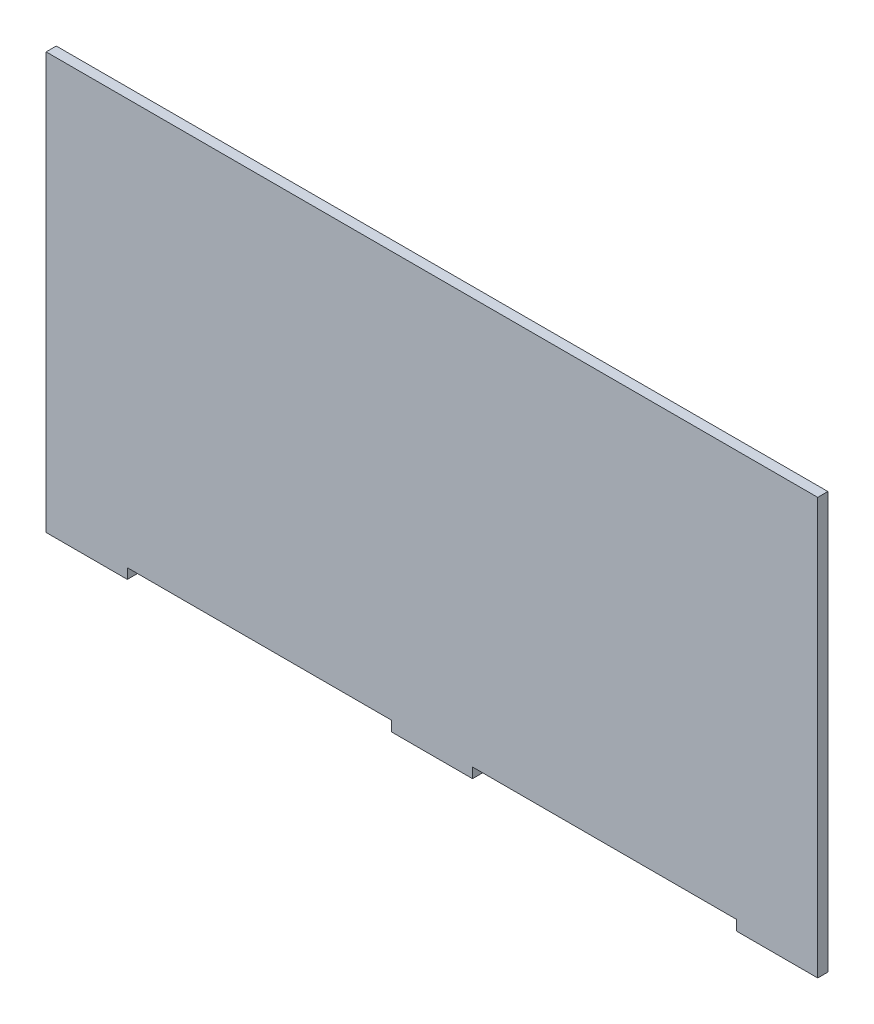
ISO-10303-21;
HEADER;
FILE_DESCRIPTION(('STEP AP214'),'2;1');
FILE_NAME('part.step','',(''),(''),'','','');
FILE_SCHEMA(('AUTOMOTIVE_DESIGN { 1 0 10303 214 1 1 1 1 }'));
ENDSEC;
DATA;
#1=APPLICATION_CONTEXT('core data for automotive mechanical design processes');
#2=APPLICATION_PROTOCOL_DEFINITION('international standard','automotive_design',2000,#1);
#3=PRODUCT_CONTEXT('',#1,'mechanical');
#4=PRODUCT('Part','Part','',(#3));
#5=PRODUCT_RELATED_PRODUCT_CATEGORY('part','',(#4));
#6=PRODUCT_DEFINITION_FORMATION('','',#4);
#7=PRODUCT_DEFINITION_CONTEXT('part definition',#1,'design');
#8=PRODUCT_DEFINITION('design','',#6,#7);
#9=PRODUCT_DEFINITION_SHAPE('','',#8);
#10=(LENGTH_UNIT() NAMED_UNIT(*) SI_UNIT(.MILLI.,.METRE.));
#11=(NAMED_UNIT(*) PLANE_ANGLE_UNIT() SI_UNIT($,.RADIAN.));
#12=(NAMED_UNIT(*) SI_UNIT($,.STERADIAN.) SOLID_ANGLE_UNIT());
#13=UNCERTAINTY_MEASURE_WITH_UNIT(LENGTH_MEASURE(1.E-05),#10,'distance_accuracy_value','');
#14=(GEOMETRIC_REPRESENTATION_CONTEXT(3) GLOBAL_UNCERTAINTY_ASSIGNED_CONTEXT((#13)) GLOBAL_UNIT_ASSIGNED_CONTEXT((#10,
#11,#12)) REPRESENTATION_CONTEXT('',''));
#15=CARTESIAN_POINT('',(0.,0.,0.));
#16=DIRECTION('',(0.,0.,1.));
#17=DIRECTION('',(1.,0.,0.));
#18=AXIS2_PLACEMENT_3D('',#15,#16,#17);
#19=CARTESIAN_POINT('',(-39.4746265952279,-50.5700031644856,5.));
#20=DIRECTION('',(1.,0.,0.));
#21=DIRECTION('',(0.,1.,0.));
#22=AXIS2_PLACEMENT_3D('',#19,#20,#21);
#23=PLANE('',#22);
#24=DIRECTION('',(0.,-1.,0.));
#25=VECTOR('',#24,1.);
#26=CARTESIAN_POINT('',(-39.4746265952279,-50.5700031644856,0.));
#27=LINE('',#26,#25);
#28=CARTESIAN_POINT('',(-39.4746265952279,154.429996835514,0.));
#29=VERTEX_POINT('',#28);
#30=CARTESIAN_POINT('',(-39.4746265952279,-50.5700031644856,0.));
#31=VERTEX_POINT('',#30);
#32=EDGE_CURVE('E159',#29,#31,#27,.T.);
#33=ORIENTED_EDGE('',*,*,#32,.T.);
#34=DIRECTION('',(0.,0.,-1.));
#35=VECTOR('',#34,1.);
#36=CARTESIAN_POINT('',(-39.4746265952279,-50.5700031644856,5.));
#37=LINE('',#36,#35);
#38=CARTESIAN_POINT('',(-39.4746265952279,-50.5700031644856,5.));
#39=VERTEX_POINT('',#38);
#40=EDGE_CURVE('E11',#39,#31,#37,.T.);
#41=ORIENTED_EDGE('',*,*,#40,.F.);
#42=DIRECTION('',(0.,-1.,0.));
#43=VECTOR('',#42,1.);
#44=CARTESIAN_POINT('',(-39.4746265952279,-50.5700031644856,5.));
#45=LINE('',#44,#43);
#46=CARTESIAN_POINT('',(-39.4746265952279,154.429996835514,5.));
#47=VERTEX_POINT('',#46);
#48=EDGE_CURVE('E181',#47,#39,#45,.T.);
#49=ORIENTED_EDGE('',*,*,#48,.F.);
#50=DIRECTION('',(0.,0.,-1.));
#51=VECTOR('',#50,1.);
#52=CARTESIAN_POINT('',(-39.4746265952279,154.429996835514,5.));
#53=LINE('',#52,#51);
#54=EDGE_CURVE('E155',#47,#29,#53,.T.);
#55=ORIENTED_EDGE('',*,*,#54,.T.);
#56=EDGE_LOOP('',(#33,#41,#49,#55));
#57=FACE_BOUND('',#56,.T.);
#58=ADVANCED_FACE('F39',(#57),#23,.F.);
#59=CARTESIAN_POINT('',(-39.4746265952279,-50.5700031644856,5.));
#60=DIRECTION('',(0.,1.,0.));
#61=DIRECTION('',(-1.,0.,0.));
#62=AXIS2_PLACEMENT_3D('',#59,#60,#61);
#63=PLANE('',#62);
#64=DIRECTION('',(1.,0.,0.));
#65=VECTOR('',#64,1.);
#66=CARTESIAN_POINT('',(-39.4746265952279,-50.5700031644856,0.));
#67=LINE('',#66,#65);
#68=CARTESIAN_POINT('',(0.525373404772073,-50.5700031644856,0.));
#69=VERTEX_POINT('',#68);
#70=EDGE_CURVE('E162',#31,#69,#67,.T.);
#71=ORIENTED_EDGE('',*,*,#70,.T.);
#72=DIRECTION('',(0.,0.,-1.));
#73=VECTOR('',#72,1.);
#74=CARTESIAN_POINT('',(0.525373404772073,-50.5700031644856,5.));
#75=LINE('',#74,#73);
#76=CARTESIAN_POINT('',(0.525373404772073,-50.5700031644856,5.));
#77=VERTEX_POINT('',#76);
#78=EDGE_CURVE('E47',#77,#69,#75,.T.);
#79=ORIENTED_EDGE('',*,*,#78,.F.);
#80=DIRECTION('',(1.,0.,0.));
#81=VECTOR('',#80,1.);
#82=CARTESIAN_POINT('',(-39.4746265952279,-50.5700031644856,5.));
#83=LINE('',#82,#81);
#84=EDGE_CURVE('E110',#39,#77,#83,.T.);
#85=ORIENTED_EDGE('',*,*,#84,.F.);
#86=ORIENTED_EDGE('',*,*,#40,.T.);
#87=EDGE_LOOP('',(#71,#79,#85,#86));
#88=FACE_BOUND('',#87,.T.);
#89=ADVANCED_FACE('F259',(#88),#63,.F.);
#90=CARTESIAN_POINT('',(0.525373404772073,-50.5700031644856,5.));
#91=DIRECTION('',(-1.,0.,0.));
#92=DIRECTION('',(0.,-1.,0.));
#93=AXIS2_PLACEMENT_3D('',#90,#91,#92);
#94=PLANE('',#93);
#95=DIRECTION('',(0.,1.,0.));
#96=VECTOR('',#95,1.);
#97=CARTESIAN_POINT('',(0.525373404772073,-50.5700031644856,0.));
#98=LINE('',#97,#96);
#99=CARTESIAN_POINT('',(0.525373404772073,-45.5700031644856,0.));
#100=VERTEX_POINT('',#99);
#101=EDGE_CURVE('E164',#69,#100,#98,.T.);
#102=ORIENTED_EDGE('',*,*,#101,.T.);
#103=DIRECTION('',(0.,0.,-1.));
#104=VECTOR('',#103,1.);
#105=CARTESIAN_POINT('',(0.525373404772073,-45.5700031644856,5.));
#106=LINE('',#105,#104);
#107=CARTESIAN_POINT('',(0.525373404772073,-45.5700031644856,5.));
#108=VERTEX_POINT('',#107);
#109=EDGE_CURVE('E200',#108,#100,#106,.T.);
#110=ORIENTED_EDGE('',*,*,#109,.F.);
#111=DIRECTION('',(0.,1.,0.));
#112=VECTOR('',#111,1.);
#113=CARTESIAN_POINT('',(0.525373404772073,-50.5700031644856,5.));
#114=LINE('',#113,#112);
#115=EDGE_CURVE('E208',#77,#108,#114,.T.);
#116=ORIENTED_EDGE('',*,*,#115,.F.);
#117=ORIENTED_EDGE('',*,*,#78,.T.);
#118=EDGE_LOOP('',(#102,#110,#116,#117));
#119=FACE_BOUND('',#118,.T.);
#120=ADVANCED_FACE('F206',(#119),#94,.F.);
#121=CARTESIAN_POINT('',(0.525373404772073,-45.5700031644856,5.));
#122=DIRECTION('',(0.,1.,0.));
#123=DIRECTION('',(-1.,0.,0.));
#124=AXIS2_PLACEMENT_3D('',#121,#122,#123);
#125=PLANE('',#124);
#126=DIRECTION('',(1.,0.,0.));
#127=VECTOR('',#126,1.);
#128=CARTESIAN_POINT('',(0.525373404772073,-45.5700031644856,0.));
#129=LINE('',#128,#127);
#130=CARTESIAN_POINT('',(130.525373404772,-45.5700031644856,0.));
#131=VERTEX_POINT('',#130);
#132=EDGE_CURVE('E166',#100,#131,#129,.T.);
#133=ORIENTED_EDGE('',*,*,#132,.T.);
#134=DIRECTION('',(0.,0.,-1.));
#135=VECTOR('',#134,1.);
#136=CARTESIAN_POINT('',(130.525373404772,-45.5700031644856,5.));
#137=LINE('',#136,#135);
#138=CARTESIAN_POINT('',(130.525373404772,-45.5700031644856,5.));
#139=VERTEX_POINT('',#138);
#140=EDGE_CURVE('E197',#139,#131,#137,.T.);
#141=ORIENTED_EDGE('',*,*,#140,.F.);
#142=DIRECTION('',(1.,0.,0.));
#143=VECTOR('',#142,1.);
#144=CARTESIAN_POINT('',(0.525373404772073,-45.5700031644856,5.));
#145=LINE('',#144,#143);
#146=EDGE_CURVE('E226',#108,#139,#145,.T.);
#147=ORIENTED_EDGE('',*,*,#146,.F.);
#148=ORIENTED_EDGE('',*,*,#109,.T.);
#149=EDGE_LOOP('',(#133,#141,#147,#148));
#150=FACE_BOUND('',#149,.T.);
#151=ADVANCED_FACE('F217',(#150),#125,.F.);
#152=CARTESIAN_POINT('',(130.525373404772,-45.5700031644856,5.));
#153=DIRECTION('',(1.,0.,0.));
#154=DIRECTION('',(0.,0.,-1.));
#155=AXIS2_PLACEMENT_3D('',#152,#153,#154);
#156=PLANE('',#155);
#157=DIRECTION('',(0.,-1.,0.));
#158=VECTOR('',#157,1.);
#159=CARTESIAN_POINT('',(130.525373404772,-45.5700031644856,0.));
#160=LINE('',#159,#158);
#161=CARTESIAN_POINT('',(130.525373404772,-50.5700031644856,0.));
#162=VERTEX_POINT('',#161);
#163=EDGE_CURVE('E168',#131,#162,#160,.T.);
#164=ORIENTED_EDGE('',*,*,#163,.T.);
#165=DIRECTION('',(0.,0.,-1.));
#166=VECTOR('',#165,1.);
#167=CARTESIAN_POINT('',(130.525373404772,-50.5700031644856,5.));
#168=LINE('',#167,#166);
#169=CARTESIAN_POINT('',(130.525373404772,-50.5700031644856,5.));
#170=VERTEX_POINT('',#169);
#171=EDGE_CURVE('E194',#170,#162,#168,.T.);
#172=ORIENTED_EDGE('',*,*,#171,.F.);
#173=DIRECTION('',(0.,-1.,0.));
#174=VECTOR('',#173,1.);
#175=CARTESIAN_POINT('',(130.525373404772,-45.5700031644856,5.));
#176=LINE('',#175,#174);
#177=EDGE_CURVE('E223',#139,#170,#176,.T.);
#178=ORIENTED_EDGE('',*,*,#177,.F.);
#179=ORIENTED_EDGE('',*,*,#140,.T.);
#180=EDGE_LOOP('',(#164,#172,#178,#179));
#181=FACE_BOUND('',#180,.T.);
#182=ADVANCED_FACE('F221',(#181),#156,.F.);
#183=CARTESIAN_POINT('',(130.525373404772,-50.5700031644856,5.));
#184=DIRECTION('',(0.,1.,0.));
#185=DIRECTION('',(0.,0.,1.));
#186=AXIS2_PLACEMENT_3D('',#183,#184,#185);
#187=PLANE('',#186);
#188=DIRECTION('',(1.,0.,0.));
#189=VECTOR('',#188,1.);
#190=CARTESIAN_POINT('',(130.525373404772,-50.5700031644856,0.));
#191=LINE('',#190,#189);
#192=CARTESIAN_POINT('',(170.525373404772,-50.5700031644856,0.));
#193=VERTEX_POINT('',#192);
#194=EDGE_CURVE('E170',#162,#193,#191,.T.);
#195=ORIENTED_EDGE('',*,*,#194,.T.);
#196=DIRECTION('',(0.,0.,-1.));
#197=VECTOR('',#196,1.);
#198=CARTESIAN_POINT('',(170.525373404772,-50.5700031644856,5.));
#199=LINE('',#198,#197);
#200=CARTESIAN_POINT('',(170.525373404772,-50.5700031644856,5.));
#201=VERTEX_POINT('',#200);
#202=EDGE_CURVE('E191',#201,#193,#199,.T.);
#203=ORIENTED_EDGE('',*,*,#202,.F.);
#204=DIRECTION('',(1.,0.,0.));
#205=VECTOR('',#204,1.);
#206=CARTESIAN_POINT('',(130.525373404772,-50.5700031644856,5.));
#207=LINE('',#206,#205);
#208=EDGE_CURVE('E225',#170,#201,#207,.T.);
#209=ORIENTED_EDGE('',*,*,#208,.F.);
#210=ORIENTED_EDGE('',*,*,#171,.T.);
#211=EDGE_LOOP('',(#195,#203,#209,#210));
#212=FACE_BOUND('',#211,.T.);
#213=ADVANCED_FACE('F272',(#212),#187,.F.);
#214=CARTESIAN_POINT('',(170.525373404772,-50.5700031644856,5.));
#215=DIRECTION('',(-1.,0.,0.));
#216=DIRECTION('',(0.,0.,1.));
#217=AXIS2_PLACEMENT_3D('',#214,#215,#216);
#218=PLANE('',#217);
#219=DIRECTION('',(0.,1.,0.));
#220=VECTOR('',#219,1.);
#221=CARTESIAN_POINT('',(170.525373404772,-50.5700031644856,0.));
#222=LINE('',#221,#220);
#223=CARTESIAN_POINT('',(170.525373404772,-45.5700031644856,0.));
#224=VERTEX_POINT('',#223);
#225=EDGE_CURVE('E172',#193,#224,#222,.T.);
#226=ORIENTED_EDGE('',*,*,#225,.T.);
#227=DIRECTION('',(0.,0.,-1.));
#228=VECTOR('',#227,1.);
#229=CARTESIAN_POINT('',(170.525373404772,-45.5700031644856,5.));
#230=LINE('',#229,#228);
#231=CARTESIAN_POINT('',(170.525373404772,-45.5700031644856,5.));
#232=VERTEX_POINT('',#231);
#233=EDGE_CURVE('E188',#232,#224,#230,.T.);
#234=ORIENTED_EDGE('',*,*,#233,.F.);
#235=DIRECTION('',(0.,1.,0.));
#236=VECTOR('',#235,1.);
#237=CARTESIAN_POINT('',(170.525373404772,-50.5700031644856,5.));
#238=LINE('',#237,#236);
#239=EDGE_CURVE('E228',#201,#232,#238,.T.);
#240=ORIENTED_EDGE('',*,*,#239,.F.);
#241=ORIENTED_EDGE('',*,*,#202,.T.);
#242=EDGE_LOOP('',(#226,#234,#240,#241));
#243=FACE_BOUND('',#242,.T.);
#244=ADVANCED_FACE('F275',(#243),#218,.F.);
#245=CARTESIAN_POINT('',(170.525373404772,-45.5700031644856,5.));
#246=DIRECTION('',(0.,1.,0.));
#247=DIRECTION('',(0.,0.,1.));
#248=AXIS2_PLACEMENT_3D('',#245,#246,#247);
#249=PLANE('',#248);
#250=DIRECTION('',(1.,0.,0.));
#251=VECTOR('',#250,1.);
#252=CARTESIAN_POINT('',(170.525373404772,-45.5700031644856,0.));
#253=LINE('',#252,#251);
#254=CARTESIAN_POINT('',(300.525373404772,-45.5700031644856,0.));
#255=VERTEX_POINT('',#254);
#256=EDGE_CURVE('E174',#224,#255,#253,.T.);
#257=ORIENTED_EDGE('',*,*,#256,.T.);
#258=DIRECTION('',(0.,0.,-1.));
#259=VECTOR('',#258,1.);
#260=CARTESIAN_POINT('',(300.525373404772,-45.5700031644856,5.));
#261=LINE('',#260,#259);
#262=CARTESIAN_POINT('',(300.525373404772,-45.5700031644856,5.));
#263=VERTEX_POINT('',#262);
#264=EDGE_CURVE('E185',#263,#255,#261,.T.);
#265=ORIENTED_EDGE('',*,*,#264,.F.);
#266=DIRECTION('',(1.,0.,0.));
#267=VECTOR('',#266,1.);
#268=CARTESIAN_POINT('',(170.525373404772,-45.5700031644856,5.));
#269=LINE('',#268,#267);
#270=EDGE_CURVE('E234',#232,#263,#269,.T.);
#271=ORIENTED_EDGE('',*,*,#270,.F.);
#272=ORIENTED_EDGE('',*,*,#233,.T.);
#273=EDGE_LOOP('',(#257,#265,#271,#272));
#274=FACE_BOUND('',#273,.T.);
#275=ADVANCED_FACE('F240',(#274),#249,.F.);
#276=CARTESIAN_POINT('',(300.525373404772,-45.5700031644856,5.));
#277=DIRECTION('',(1.,0.,0.));
#278=DIRECTION('',(0.,0.,-1.));
#279=AXIS2_PLACEMENT_3D('',#276,#277,#278);
#280=PLANE('',#279);
#281=DIRECTION('',(0.,-1.,0.));
#282=VECTOR('',#281,1.);
#283=CARTESIAN_POINT('',(300.525373404772,-45.5700031644856,0.));
#284=LINE('',#283,#282);
#285=CARTESIAN_POINT('',(300.525373404772,-50.5700031644856,0.));
#286=VERTEX_POINT('',#285);
#287=EDGE_CURVE('E176',#255,#286,#284,.T.);
#288=ORIENTED_EDGE('',*,*,#287,.T.);
#289=DIRECTION('',(0.,0.,-1.));
#290=VECTOR('',#289,1.);
#291=CARTESIAN_POINT('',(300.525373404772,-50.5700031644856,5.));
#292=LINE('',#291,#290);
#293=CARTESIAN_POINT('',(300.525373404772,-50.5700031644856,5.));
#294=VERTEX_POINT('',#293);
#295=EDGE_CURVE('E150',#294,#286,#292,.T.);
#296=ORIENTED_EDGE('',*,*,#295,.F.);
#297=DIRECTION('',(0.,-1.,0.));
#298=VECTOR('',#297,1.);
#299=CARTESIAN_POINT('',(300.525373404772,-45.5700031644856,5.));
#300=LINE('',#299,#298);
#301=EDGE_CURVE('E141',#263,#294,#300,.T.);
#302=ORIENTED_EDGE('',*,*,#301,.F.);
#303=ORIENTED_EDGE('',*,*,#264,.T.);
#304=EDGE_LOOP('',(#288,#296,#302,#303));
#305=FACE_BOUND('',#304,.T.);
#306=ADVANCED_FACE('F244',(#305),#280,.F.);
#307=CARTESIAN_POINT('',(300.525373404772,-50.5700031644856,5.));
#308=DIRECTION('',(0.,1.,0.));
#309=DIRECTION('',(0.,0.,1.));
#310=AXIS2_PLACEMENT_3D('',#307,#308,#309);
#311=PLANE('',#310);
#312=DIRECTION('',(1.,0.,0.));
#313=VECTOR('',#312,1.);
#314=CARTESIAN_POINT('',(300.525373404772,-50.5700031644856,0.));
#315=LINE('',#314,#313);
#316=CARTESIAN_POINT('',(340.525373404772,-50.5700031644856,0.));
#317=VERTEX_POINT('',#316);
#318=EDGE_CURVE('E149',#286,#317,#315,.T.);
#319=ORIENTED_EDGE('',*,*,#318,.T.);
#320=DIRECTION('',(0.,0.,-1.));
#321=VECTOR('',#320,1.);
#322=CARTESIAN_POINT('',(340.525373404772,-50.5700031644856,5.));
#323=LINE('',#322,#321);
#324=CARTESIAN_POINT('',(340.525373404772,-50.5700031644856,5.));
#325=VERTEX_POINT('',#324);
#326=EDGE_CURVE('E146',#325,#317,#323,.T.);
#327=ORIENTED_EDGE('',*,*,#326,.F.);
#328=DIRECTION('',(1.,0.,0.));
#329=VECTOR('',#328,1.);
#330=CARTESIAN_POINT('',(300.525373404772,-50.5700031644856,5.));
#331=LINE('',#330,#329);
#332=EDGE_CURVE('E135',#294,#325,#331,.T.);
#333=ORIENTED_EDGE('',*,*,#332,.F.);
#334=ORIENTED_EDGE('',*,*,#295,.T.);
#335=EDGE_LOOP('',(#319,#327,#333,#334));
#336=FACE_BOUND('',#335,.T.);
#337=ADVANCED_FACE('F147',(#336),#311,.F.);
#338=CARTESIAN_POINT('',(340.525373404772,-50.5700031644856,5.));
#339=DIRECTION('',(-1.,0.,0.));
#340=DIRECTION('',(0.,0.,1.));
#341=AXIS2_PLACEMENT_3D('',#338,#339,#340);
#342=PLANE('',#341);
#343=DIRECTION('',(0.,1.,0.));
#344=VECTOR('',#343,1.);
#345=CARTESIAN_POINT('',(340.525373404772,-50.5700031644856,0.));
#346=LINE('',#345,#344);
#347=CARTESIAN_POINT('',(340.525373404772,154.429996835514,0.));
#348=VERTEX_POINT('',#347);
#349=EDGE_CURVE('E96',#317,#348,#346,.T.);
#350=ORIENTED_EDGE('',*,*,#349,.T.);
#351=DIRECTION('',(0.,0.,-1.));
#352=VECTOR('',#351,1.);
#353=CARTESIAN_POINT('',(340.525373404772,154.429996835514,5.));
#354=LINE('',#353,#352);
#355=CARTESIAN_POINT('',(340.525373404772,154.429996835514,5.));
#356=VERTEX_POINT('',#355);
#357=EDGE_CURVE('E151',#356,#348,#354,.T.);
#358=ORIENTED_EDGE('',*,*,#357,.F.);
#359=DIRECTION('',(0.,1.,0.));
#360=VECTOR('',#359,1.);
#361=CARTESIAN_POINT('',(340.525373404772,-50.5700031644856,5.));
#362=LINE('',#361,#360);
#363=EDGE_CURVE('E139',#325,#356,#362,.T.);
#364=ORIENTED_EDGE('',*,*,#363,.F.);
#365=ORIENTED_EDGE('',*,*,#326,.T.);
#366=EDGE_LOOP('',(#350,#358,#364,#365));
#367=FACE_BOUND('',#366,.T.);
#368=ADVANCED_FACE('F153',(#367),#342,.F.);
#369=CARTESIAN_POINT('',(340.525373404772,154.429996835514,5.));
#370=DIRECTION('',(0.,-1.,0.));
#371=DIRECTION('',(1.,0.,0.));
#372=AXIS2_PLACEMENT_3D('',#369,#370,#371);
#373=PLANE('',#372);
#374=DIRECTION('',(-1.,0.,0.));
#375=VECTOR('',#374,1.);
#376=CARTESIAN_POINT('',(340.525373404772,154.429996835514,0.));
#377=LINE('',#376,#375);
#378=EDGE_CURVE('E102',#348,#29,#377,.T.);
#379=ORIENTED_EDGE('',*,*,#378,.T.);
#380=ORIENTED_EDGE('',*,*,#54,.F.);
#381=DIRECTION('',(-1.,0.,0.));
#382=VECTOR('',#381,1.);
#383=CARTESIAN_POINT('',(340.525373404772,154.429996835514,5.));
#384=LINE('',#383,#382);
#385=EDGE_CURVE('E55',#356,#47,#384,.T.);
#386=ORIENTED_EDGE('',*,*,#385,.F.);
#387=ORIENTED_EDGE('',*,*,#357,.T.);
#388=EDGE_LOOP('',(#379,#380,#386,#387));
#389=FACE_BOUND('',#388,.T.);
#390=ADVANCED_FACE('F248',(#389),#373,.F.);
#391=CARTESIAN_POINT('',(0.,0.,5.));
#392=DIRECTION('',(0.,0.,1.));
#393=DIRECTION('',(1.,0.,0.));
#394=AXIS2_PLACEMENT_3D('',#391,#392,#393);
#395=PLANE('',#394);
#396=ORIENTED_EDGE('',*,*,#48,.T.);
#397=ORIENTED_EDGE('',*,*,#84,.T.);
#398=ORIENTED_EDGE('',*,*,#115,.T.);
#399=ORIENTED_EDGE('',*,*,#146,.T.);
#400=ORIENTED_EDGE('',*,*,#177,.T.);
#401=ORIENTED_EDGE('',*,*,#208,.T.);
#402=ORIENTED_EDGE('',*,*,#239,.T.);
#403=ORIENTED_EDGE('',*,*,#270,.T.);
#404=ORIENTED_EDGE('',*,*,#301,.T.);
#405=ORIENTED_EDGE('',*,*,#332,.T.);
#406=ORIENTED_EDGE('',*,*,#363,.T.);
#407=ORIENTED_EDGE('',*,*,#385,.T.);
#408=EDGE_LOOP('',(#396,#397,#398,#399,#400,#401,#402,#403,#404,#405,#406,#407));
#409=FACE_BOUND('',#408,.T.);
#410=ADVANCED_FACE('F137',(#409),#395,.T.);
#411=CARTESIAN_POINT('',(0.,0.,0.));
#412=DIRECTION('',(0.,0.,1.));
#413=DIRECTION('',(1.,0.,0.));
#414=AXIS2_PLACEMENT_3D('',#411,#412,#413);
#415=PLANE('',#414);
#416=ORIENTED_EDGE('',*,*,#32,.F.);
#417=ORIENTED_EDGE('',*,*,#378,.F.);
#418=ORIENTED_EDGE('',*,*,#349,.F.);
#419=ORIENTED_EDGE('',*,*,#318,.F.);
#420=ORIENTED_EDGE('',*,*,#287,.F.);
#421=ORIENTED_EDGE('',*,*,#256,.F.);
#422=ORIENTED_EDGE('',*,*,#225,.F.);
#423=ORIENTED_EDGE('',*,*,#194,.F.);
#424=ORIENTED_EDGE('',*,*,#163,.F.);
#425=ORIENTED_EDGE('',*,*,#132,.F.);
#426=ORIENTED_EDGE('',*,*,#101,.F.);
#427=ORIENTED_EDGE('',*,*,#70,.F.);
#428=EDGE_LOOP('',(#416,#417,#418,#419,#420,#421,#422,#423,#424,#425,#426,#427));
#429=FACE_BOUND('',#428,.T.);
#430=ADVANCED_FACE('F212',(#429),#415,.F.);
#431=CLOSED_SHELL('',(#58,#89,#120,#151,#182,#213,#244,#275,#306,#337,#368,#390,#410,#430));
#432=MANIFOLD_SOLID_BREP('B2',#431);
#433=ADVANCED_BREP_SHAPE_REPRESENTATION('',(#18,#432),#14);
#434=SHAPE_DEFINITION_REPRESENTATION(#9,#433);
ENDSEC;
END-ISO-10303-21;
